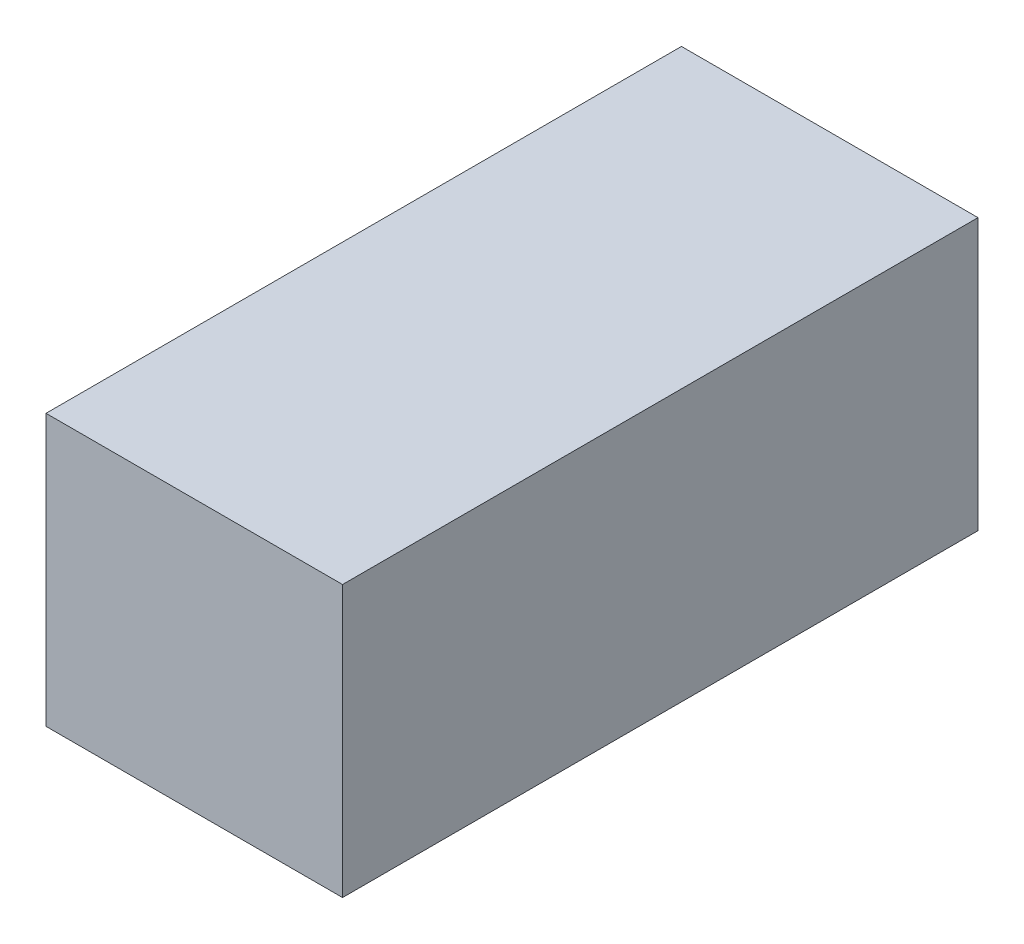
ISO-10303-21;
HEADER;
FILE_DESCRIPTION(('STEP AP214'),'2;1');
FILE_NAME('part.step','',(''),(''),'','','');
FILE_SCHEMA(('AUTOMOTIVE_DESIGN { 1 0 10303 214 1 1 1 1 }'));
ENDSEC;
DATA;
#1=APPLICATION_CONTEXT('core data for automotive mechanical design processes');
#2=APPLICATION_PROTOCOL_DEFINITION('international standard','automotive_design',2000,#1);
#3=PRODUCT_CONTEXT('',#1,'mechanical');
#4=PRODUCT('Part','Part','',(#3));
#5=PRODUCT_RELATED_PRODUCT_CATEGORY('part','',(#4));
#6=PRODUCT_DEFINITION_FORMATION('','',#4);
#7=PRODUCT_DEFINITION_CONTEXT('part definition',#1,'design');
#8=PRODUCT_DEFINITION('design','',#6,#7);
#9=PRODUCT_DEFINITION_SHAPE('','',#8);
#10=(LENGTH_UNIT() NAMED_UNIT(*) SI_UNIT(.MILLI.,.METRE.));
#11=(NAMED_UNIT(*) PLANE_ANGLE_UNIT() SI_UNIT($,.RADIAN.));
#12=(NAMED_UNIT(*) SI_UNIT($,.STERADIAN.) SOLID_ANGLE_UNIT());
#13=UNCERTAINTY_MEASURE_WITH_UNIT(LENGTH_MEASURE(1.E-05),#10,'distance_accuracy_value','');
#14=(GEOMETRIC_REPRESENTATION_CONTEXT(3) GLOBAL_UNCERTAINTY_ASSIGNED_CONTEXT((#13)) GLOBAL_UNIT_ASSIGNED_CONTEXT((#10,
#11,#12)) REPRESENTATION_CONTEXT('',''));
#15=CARTESIAN_POINT('',(0.,0.,0.));
#16=DIRECTION('',(0.,0.,1.));
#17=DIRECTION('',(1.,0.,0.));
#18=AXIS2_PLACEMENT_3D('',#15,#16,#17);
#19=CARTESIAN_POINT('',(-17.5,-15.,0.));
#20=DIRECTION('',(-1.,0.,0.));
#21=DIRECTION('',(0.,0.,1.));
#22=AXIS2_PLACEMENT_3D('',#19,#20,#21);
#23=PLANE('',#22);
#24=DIRECTION('',(0.,0.,1.));
#25=VECTOR('',#24,1.);
#26=CARTESIAN_POINT('',(-17.5,17.,0.));
#27=LINE('',#26,#25);
#28=CARTESIAN_POINT('',(-17.5,17.,0.));
#29=VERTEX_POINT('',#28);
#30=CARTESIAN_POINT('',(-17.5,17.,75.));
#31=VERTEX_POINT('',#30);
#32=EDGE_CURVE('E98',#29,#31,#27,.T.);
#33=ORIENTED_EDGE('',*,*,#32,.F.);
#34=DIRECTION('',(0.,1.,0.));
#35=VECTOR('',#34,1.);
#36=CARTESIAN_POINT('',(-17.5,-15.,0.));
#37=LINE('',#36,#35);
#38=CARTESIAN_POINT('',(-17.5,-15.,0.));
#39=VERTEX_POINT('',#38);
#40=EDGE_CURVE('E11',#39,#29,#37,.T.);
#41=ORIENTED_EDGE('',*,*,#40,.F.);
#42=DIRECTION('',(0.,0.,1.));
#43=VECTOR('',#42,1.);
#44=CARTESIAN_POINT('',(-17.5,-15.,0.));
#45=LINE('',#44,#43);
#46=CARTESIAN_POINT('',(-17.5,-15.,75.));
#47=VERTEX_POINT('',#46);
#48=EDGE_CURVE('E92',#39,#47,#45,.T.);
#49=ORIENTED_EDGE('',*,*,#48,.T.);
#50=DIRECTION('',(0.,1.,0.));
#51=VECTOR('',#50,1.);
#52=CARTESIAN_POINT('',(-17.5,-15.,75.));
#53=LINE('',#52,#51);
#54=EDGE_CURVE('E37',#47,#31,#53,.T.);
#55=ORIENTED_EDGE('',*,*,#54,.T.);
#56=EDGE_LOOP('',(#33,#41,#49,#55));
#57=FACE_BOUND('',#56,.T.);
#58=ADVANCED_FACE('F34',(#57),#23,.T.);
#59=CARTESIAN_POINT('',(17.5,-15.,0.));
#60=DIRECTION('',(0.,0.,-1.));
#61=DIRECTION('',(-1.,0.,0.));
#62=AXIS2_PLACEMENT_3D('',#59,#60,#61);
#63=PLANE('',#62);
#64=DIRECTION('',(-1.,0.,0.));
#65=VECTOR('',#64,1.);
#66=CARTESIAN_POINT('',(17.5,17.,0.));
#67=LINE('',#66,#65);
#68=CARTESIAN_POINT('',(17.5,17.,0.));
#69=VERTEX_POINT('',#68);
#70=EDGE_CURVE('E94',#69,#29,#67,.T.);
#71=ORIENTED_EDGE('',*,*,#70,.F.);
#72=DIRECTION('',(0.,1.,0.));
#73=VECTOR('',#72,1.);
#74=CARTESIAN_POINT('',(17.5,-15.,0.));
#75=LINE('',#74,#73);
#76=CARTESIAN_POINT('',(17.5,-15.,0.));
#77=VERTEX_POINT('',#76);
#78=EDGE_CURVE('E43',#77,#69,#75,.T.);
#79=ORIENTED_EDGE('',*,*,#78,.F.);
#80=DIRECTION('',(-1.,0.,0.));
#81=VECTOR('',#80,1.);
#82=CARTESIAN_POINT('',(17.5,-15.,0.));
#83=LINE('',#82,#81);
#84=EDGE_CURVE('E89',#77,#39,#83,.T.);
#85=ORIENTED_EDGE('',*,*,#84,.T.);
#86=ORIENTED_EDGE('',*,*,#40,.T.);
#87=EDGE_LOOP('',(#71,#79,#85,#86));
#88=FACE_BOUND('',#87,.T.);
#89=ADVANCED_FACE('F108',(#88),#63,.T.);
#90=CARTESIAN_POINT('',(17.5,-15.,75.));
#91=DIRECTION('',(1.,0.,0.));
#92=DIRECTION('',(0.,0.,-1.));
#93=AXIS2_PLACEMENT_3D('',#90,#91,#92);
#94=PLANE('',#93);
#95=DIRECTION('',(0.,0.,-1.));
#96=VECTOR('',#95,1.);
#97=CARTESIAN_POINT('',(17.5,17.,75.));
#98=LINE('',#97,#96);
#99=CARTESIAN_POINT('',(17.5,17.,75.));
#100=VERTEX_POINT('',#99);
#101=EDGE_CURVE('E84',#100,#69,#98,.T.);
#102=ORIENTED_EDGE('',*,*,#101,.F.);
#103=DIRECTION('',(0.,1.,0.));
#104=VECTOR('',#103,1.);
#105=CARTESIAN_POINT('',(17.5,-15.,75.));
#106=LINE('',#105,#104);
#107=CARTESIAN_POINT('',(17.5,-15.,75.));
#108=VERTEX_POINT('',#107);
#109=EDGE_CURVE('E79',#108,#100,#106,.T.);
#110=ORIENTED_EDGE('',*,*,#109,.F.);
#111=DIRECTION('',(0.,0.,-1.));
#112=VECTOR('',#111,1.);
#113=CARTESIAN_POINT('',(17.5,-15.,75.));
#114=LINE('',#113,#112);
#115=EDGE_CURVE('E82',#108,#77,#114,.T.);
#116=ORIENTED_EDGE('',*,*,#115,.T.);
#117=ORIENTED_EDGE('',*,*,#78,.T.);
#118=EDGE_LOOP('',(#102,#110,#116,#117));
#119=FACE_BOUND('',#118,.T.);
#120=ADVANCED_FACE('F81',(#119),#94,.T.);
#121=CARTESIAN_POINT('',(-17.5,-15.,75.));
#122=DIRECTION('',(0.,0.,1.));
#123=DIRECTION('',(1.,0.,0.));
#124=AXIS2_PLACEMENT_3D('',#121,#122,#123);
#125=PLANE('',#124);
#126=DIRECTION('',(1.,0.,0.));
#127=VECTOR('',#126,1.);
#128=CARTESIAN_POINT('',(-17.5,17.,75.));
#129=LINE('',#128,#127);
#130=EDGE_CURVE('E101',#31,#100,#129,.T.);
#131=ORIENTED_EDGE('',*,*,#130,.F.);
#132=ORIENTED_EDGE('',*,*,#54,.F.);
#133=DIRECTION('',(1.,0.,0.));
#134=VECTOR('',#133,1.);
#135=CARTESIAN_POINT('',(-17.5,-15.,75.));
#136=LINE('',#135,#134);
#137=EDGE_CURVE('E88',#47,#108,#136,.T.);
#138=ORIENTED_EDGE('',*,*,#137,.T.);
#139=ORIENTED_EDGE('',*,*,#109,.T.);
#140=EDGE_LOOP('',(#131,#132,#138,#139));
#141=FACE_BOUND('',#140,.T.);
#142=ADVANCED_FACE('F91',(#141),#125,.T.);
#143=CARTESIAN_POINT('',(0.,-15.,0.));
#144=DIRECTION('',(0.,1.,0.));
#145=DIRECTION('',(0.,0.,1.));
#146=AXIS2_PLACEMENT_3D('',#143,#144,#145);
#147=PLANE('',#146);
#148=ORIENTED_EDGE('',*,*,#48,.F.);
#149=ORIENTED_EDGE('',*,*,#84,.F.);
#150=ORIENTED_EDGE('',*,*,#115,.F.);
#151=ORIENTED_EDGE('',*,*,#137,.F.);
#152=EDGE_LOOP('',(#148,#149,#150,#151));
#153=FACE_BOUND('',#152,.T.);
#154=ADVANCED_FACE('F87',(#153),#147,.F.);
#155=CARTESIAN_POINT('',(0.,17.,0.));
#156=DIRECTION('',(0.,1.,0.));
#157=DIRECTION('',(0.,0.,1.));
#158=AXIS2_PLACEMENT_3D('',#155,#156,#157);
#159=PLANE('',#158);
#160=ORIENTED_EDGE('',*,*,#32,.T.);
#161=ORIENTED_EDGE('',*,*,#130,.T.);
#162=ORIENTED_EDGE('',*,*,#101,.T.);
#163=ORIENTED_EDGE('',*,*,#70,.T.);
#164=EDGE_LOOP('',(#160,#161,#162,#163));
#165=FACE_BOUND('',#164,.T.);
#166=ADVANCED_FACE('F107',(#165),#159,.T.);
#167=CLOSED_SHELL('',(#58,#89,#120,#142,#154,#166));
#168=MANIFOLD_SOLID_BREP('B2',#167);
#169=ADVANCED_BREP_SHAPE_REPRESENTATION('',(#18,#168),#14);
#170=SHAPE_DEFINITION_REPRESENTATION(#9,#169);
ENDSEC;
END-ISO-10303-21;
